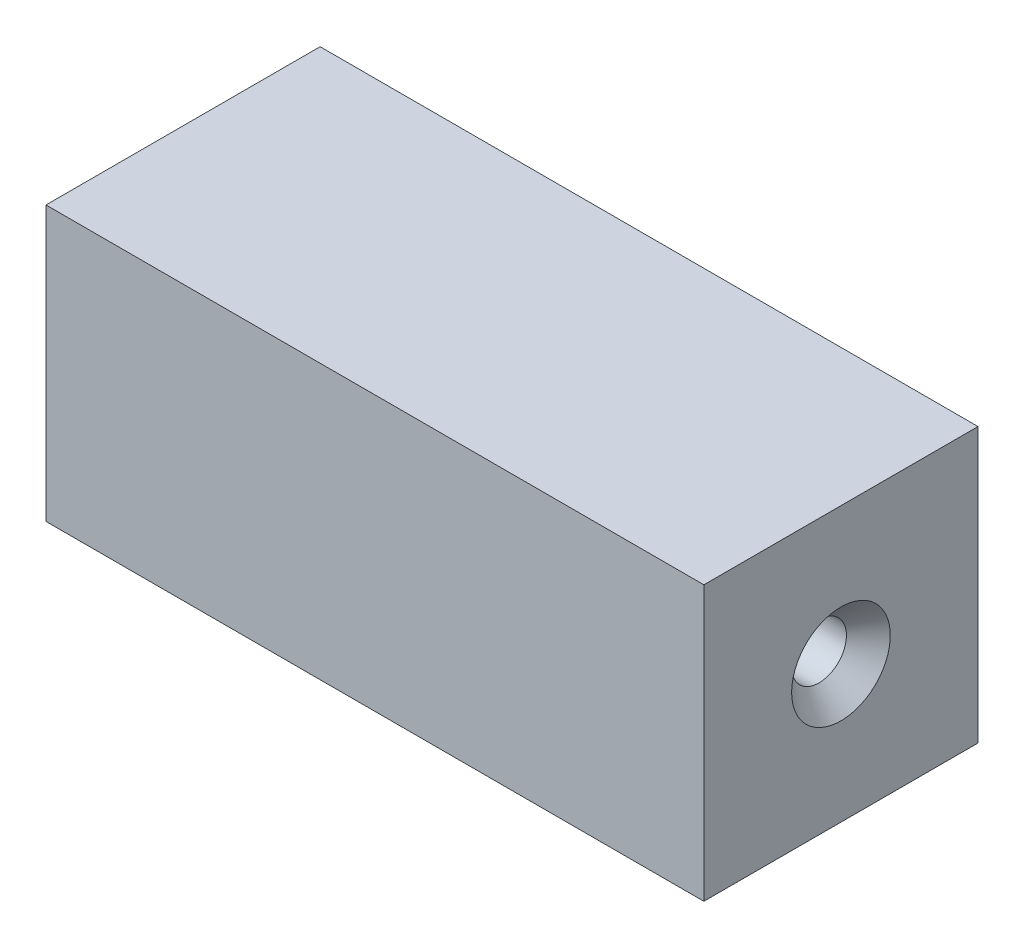
ISO-10303-21;
HEADER;
FILE_DESCRIPTION(('STEP AP214'),'2;1');
FILE_NAME('part.step','',(''),(''),'','','');
FILE_SCHEMA(('AUTOMOTIVE_DESIGN { 1 0 10303 214 1 1 1 1 }'));
ENDSEC;
DATA;
#1=APPLICATION_CONTEXT('core data for automotive mechanical design processes');
#2=APPLICATION_PROTOCOL_DEFINITION('international standard','automotive_design',2000,#1);
#3=PRODUCT_CONTEXT('',#1,'mechanical');
#4=PRODUCT('Part','Part','',(#3));
#5=PRODUCT_RELATED_PRODUCT_CATEGORY('part','',(#4));
#6=PRODUCT_DEFINITION_FORMATION('','',#4);
#7=PRODUCT_DEFINITION_CONTEXT('part definition',#1,'design');
#8=PRODUCT_DEFINITION('design','',#6,#7);
#9=PRODUCT_DEFINITION_SHAPE('','',#8);
#10=(LENGTH_UNIT() NAMED_UNIT(*) SI_UNIT(.MILLI.,.METRE.));
#11=(NAMED_UNIT(*) PLANE_ANGLE_UNIT() SI_UNIT($,.RADIAN.));
#12=(NAMED_UNIT(*) SI_UNIT($,.STERADIAN.) SOLID_ANGLE_UNIT());
#13=UNCERTAINTY_MEASURE_WITH_UNIT(LENGTH_MEASURE(1.E-05),#10,'distance_accuracy_value','');
#14=(GEOMETRIC_REPRESENTATION_CONTEXT(3) GLOBAL_UNCERTAINTY_ASSIGNED_CONTEXT((#13)) GLOBAL_UNIT_ASSIGNED_CONTEXT((#10,
#11,#12)) REPRESENTATION_CONTEXT('',''));
#15=CARTESIAN_POINT('',(0.,0.,0.));
#16=DIRECTION('',(0.,0.,1.));
#17=DIRECTION('',(1.,0.,0.));
#18=AXIS2_PLACEMENT_3D('',#15,#16,#17);
#19=CARTESIAN_POINT('',(76.2,-15.875,15.875));
#20=DIRECTION('',(0.,0.,1.));
#21=DIRECTION('',(1.,0.,0.));
#22=AXIS2_PLACEMENT_3D('',#19,#20,#21);
#23=PLANE('',#22);
#24=DIRECTION('',(0.,1.,0.));
#25=VECTOR('',#24,1.);
#26=CARTESIAN_POINT('',(0.,-15.875,15.875));
#27=LINE('',#26,#25);
#28=CARTESIAN_POINT('',(0.,-15.875,15.875));
#29=VERTEX_POINT('',#28);
#30=CARTESIAN_POINT('',(0.,15.875,15.875));
#31=VERTEX_POINT('',#30);
#32=EDGE_CURVE('E106',#29,#31,#27,.T.);
#33=ORIENTED_EDGE('',*,*,#32,.F.);
#34=DIRECTION('',(-1.,0.,0.));
#35=VECTOR('',#34,1.);
#36=CARTESIAN_POINT('',(76.2,-15.875,15.875));
#37=LINE('',#36,#35);
#38=CARTESIAN_POINT('',(76.2,-15.875,15.875));
#39=VERTEX_POINT('',#38);
#40=EDGE_CURVE('E53',#39,#29,#37,.T.);
#41=ORIENTED_EDGE('',*,*,#40,.F.);
#42=DIRECTION('',(0.,1.,0.));
#43=VECTOR('',#42,1.);
#44=CARTESIAN_POINT('',(76.2,-15.875,15.875));
#45=LINE('',#44,#43);
#46=CARTESIAN_POINT('',(76.2,15.875,15.875));
#47=VERTEX_POINT('',#46);
#48=EDGE_CURVE('E100',#39,#47,#45,.T.);
#49=ORIENTED_EDGE('',*,*,#48,.T.);
#50=DIRECTION('',(-1.,0.,0.));
#51=VECTOR('',#50,1.);
#52=CARTESIAN_POINT('',(76.2,15.875,15.875));
#53=LINE('',#52,#51);
#54=EDGE_CURVE('E78',#47,#31,#53,.T.);
#55=ORIENTED_EDGE('',*,*,#54,.T.);
#56=EDGE_LOOP('',(#33,#41,#49,#55));
#57=FACE_BOUND('',#56,.T.);
#58=ADVANCED_FACE('F35',(#57),#23,.T.);
#59=CARTESIAN_POINT('',(76.2,-15.875,15.875));
#60=DIRECTION('',(0.,1.,0.));
#61=DIRECTION('',(0.,0.,1.));
#62=AXIS2_PLACEMENT_3D('',#59,#60,#61);
#63=PLANE('',#62);
#64=DIRECTION('',(0.,0.,-1.));
#65=VECTOR('',#64,1.);
#66=CARTESIAN_POINT('',(0.,-15.875,15.875));
#67=LINE('',#66,#65);
#68=CARTESIAN_POINT('',(0.,-15.875,-15.875));
#69=VERTEX_POINT('',#68);
#70=EDGE_CURVE('E70',#29,#69,#67,.T.);
#71=ORIENTED_EDGE('',*,*,#70,.T.);
#72=DIRECTION('',(-1.,0.,0.));
#73=VECTOR('',#72,1.);
#74=CARTESIAN_POINT('',(76.2,-15.875,-15.875));
#75=LINE('',#74,#73);
#76=CARTESIAN_POINT('',(76.2,-15.875,-15.875));
#77=VERTEX_POINT('',#76);
#78=EDGE_CURVE('E97',#77,#69,#75,.T.);
#79=ORIENTED_EDGE('',*,*,#78,.F.);
#80=DIRECTION('',(0.,0.,-1.));
#81=VECTOR('',#80,1.);
#82=CARTESIAN_POINT('',(76.2,-15.875,15.875));
#83=LINE('',#82,#81);
#84=EDGE_CURVE('E88',#39,#77,#83,.T.);
#85=ORIENTED_EDGE('',*,*,#84,.F.);
#86=ORIENTED_EDGE('',*,*,#40,.T.);
#87=EDGE_LOOP('',(#71,#79,#85,#86));
#88=FACE_BOUND('',#87,.T.);
#89=ADVANCED_FACE('F132',(#88),#63,.F.);
#90=CARTESIAN_POINT('',(76.2,-15.875,-15.875));
#91=DIRECTION('',(0.,0.,1.));
#92=DIRECTION('',(1.,0.,0.));
#93=AXIS2_PLACEMENT_3D('',#90,#91,#92);
#94=PLANE('',#93);
#95=DIRECTION('',(0.,1.,0.));
#96=VECTOR('',#95,1.);
#97=CARTESIAN_POINT('',(0.,-15.875,-15.875));
#98=LINE('',#97,#96);
#99=CARTESIAN_POINT('',(0.,15.875,-15.875));
#100=VERTEX_POINT('',#99);
#101=EDGE_CURVE('E95',#69,#100,#98,.T.);
#102=ORIENTED_EDGE('',*,*,#101,.T.);
#103=DIRECTION('',(-1.,0.,0.));
#104=VECTOR('',#103,1.);
#105=CARTESIAN_POINT('',(76.2,15.875,-15.875));
#106=LINE('',#105,#104);
#107=CARTESIAN_POINT('',(76.2,15.875,-15.875));
#108=VERTEX_POINT('',#107);
#109=EDGE_CURVE('E92',#108,#100,#106,.T.);
#110=ORIENTED_EDGE('',*,*,#109,.F.);
#111=DIRECTION('',(0.,1.,0.));
#112=VECTOR('',#111,1.);
#113=CARTESIAN_POINT('',(76.2,-15.875,-15.875));
#114=LINE('',#113,#112);
#115=EDGE_CURVE('E83',#77,#108,#114,.T.);
#116=ORIENTED_EDGE('',*,*,#115,.F.);
#117=ORIENTED_EDGE('',*,*,#78,.T.);
#118=EDGE_LOOP('',(#102,#110,#116,#117));
#119=FACE_BOUND('',#118,.T.);
#120=ADVANCED_FACE('F93',(#119),#94,.F.);
#121=CARTESIAN_POINT('',(76.2,15.875,15.875));
#122=DIRECTION('',(0.,1.,0.));
#123=DIRECTION('',(0.,0.,1.));
#124=AXIS2_PLACEMENT_3D('',#121,#122,#123);
#125=PLANE('',#124);
#126=DIRECTION('',(0.,0.,-1.));
#127=VECTOR('',#126,1.);
#128=CARTESIAN_POINT('',(0.,15.875,15.875));
#129=LINE('',#128,#127);
#130=EDGE_CURVE('E109',#31,#100,#129,.T.);
#131=ORIENTED_EDGE('',*,*,#130,.F.);
#132=ORIENTED_EDGE('',*,*,#54,.F.);
#133=DIRECTION('',(0.,0.,-1.));
#134=VECTOR('',#133,1.);
#135=CARTESIAN_POINT('',(76.2,15.875,15.875));
#136=LINE('',#135,#134);
#137=EDGE_CURVE('E87',#47,#108,#136,.T.);
#138=ORIENTED_EDGE('',*,*,#137,.T.);
#139=ORIENTED_EDGE('',*,*,#109,.T.);
#140=EDGE_LOOP('',(#131,#132,#138,#139));
#141=FACE_BOUND('',#140,.T.);
#142=ADVANCED_FACE('F99',(#141),#125,.T.);
#143=CARTESIAN_POINT('',(76.2,0.,0.));
#144=DIRECTION('',(-1.,0.,0.));
#145=DIRECTION('',(0.,0.,1.));
#146=AXIS2_PLACEMENT_3D('',#143,#144,#145);
#147=PLANE('',#146);
#148=CARTESIAN_POINT('',(76.2,0.,0.));
#149=DIRECTION('',(-1.,0.,0.));
#150=DIRECTION('',(0.,0.,1.));
#151=AXIS2_PLACEMENT_3D('',#148,#149,#150);
#152=CIRCLE('',#151,5.71499999999998);
#153=CARTESIAN_POINT('',(76.2,0.,5.71499999999998));
#154=VERTEX_POINT('',#153);
#155=EDGE_CURVE('E11',#154,#154,#152,.T.);
#156=ORIENTED_EDGE('',*,*,#155,.T.);
#157=EDGE_LOOP('',(#156));
#158=FACE_BOUND('',#157,.T.);
#159=ORIENTED_EDGE('',*,*,#48,.F.);
#160=ORIENTED_EDGE('',*,*,#84,.T.);
#161=ORIENTED_EDGE('',*,*,#115,.T.);
#162=ORIENTED_EDGE('',*,*,#137,.F.);
#163=EDGE_LOOP('',(#159,#160,#161,#162));
#164=FACE_BOUND('',#163,.T.);
#165=ADVANCED_FACE('F86',(#158,#164),#147,.F.);
#166=CARTESIAN_POINT('',(0.,0.,0.));
#167=DIRECTION('',(-1.,0.,0.));
#168=DIRECTION('',(0.,0.,1.));
#169=AXIS2_PLACEMENT_3D('',#166,#167,#168);
#170=PLANE('',#169);
#171=ORIENTED_EDGE('',*,*,#32,.T.);
#172=ORIENTED_EDGE('',*,*,#130,.T.);
#173=ORIENTED_EDGE('',*,*,#101,.F.);
#174=ORIENTED_EDGE('',*,*,#70,.F.);
#175=EDGE_LOOP('',(#171,#172,#173,#174));
#176=FACE_BOUND('',#175,.T.);
#177=ADVANCED_FACE('F142',(#176),#170,.T.);
#178=CARTESIAN_POINT('',(50.8,0.,0.));
#179=DIRECTION('',(1.,0.,0.));
#180=DIRECTION('',(0.,0.,-1.));
#181=AXIS2_PLACEMENT_3D('',#178,#179,#180);
#182=CYLINDRICAL_SURFACE('',#181,3.175);
#183=CARTESIAN_POINT('',(73.66,0.,0.));
#184=DIRECTION('',(-1.,0.,0.));
#185=DIRECTION('',(0.,0.,1.));
#186=AXIS2_PLACEMENT_3D('',#183,#184,#185);
#187=CIRCLE('',#186,3.175);
#188=CARTESIAN_POINT('',(73.66,0.,3.175));
#189=VERTEX_POINT('',#188);
#190=EDGE_CURVE('E45',#189,#189,#187,.F.);
#191=ORIENTED_EDGE('',*,*,#190,.T.);
#192=EDGE_LOOP('',(#191));
#193=FACE_BOUND('',#192,.T.);
#194=CARTESIAN_POINT('',(50.8,0.,0.));
#195=DIRECTION('',(1.,0.,0.));
#196=DIRECTION('',(0.,0.,-1.));
#197=AXIS2_PLACEMENT_3D('',#194,#195,#196);
#198=CIRCLE('',#197,3.175);
#199=CARTESIAN_POINT('',(50.8,0.,-3.175));
#200=VERTEX_POINT('',#199);
#201=EDGE_CURVE('E110',#200,#200,#198,.T.);
#202=ORIENTED_EDGE('',*,*,#201,.F.);
#203=EDGE_LOOP('',(#202));
#204=FACE_BOUND('',#203,.T.);
#205=ADVANCED_FACE('F119',(#193,#204),#182,.F.);
#206=CARTESIAN_POINT('',(50.8,0.,0.));
#207=DIRECTION('',(1.,0.,0.));
#208=DIRECTION('',(0.,0.,-1.));
#209=AXIS2_PLACEMENT_3D('',#206,#207,#208);
#210=PLANE('',#209);
#211=ORIENTED_EDGE('',*,*,#201,.T.);
#212=EDGE_LOOP('',(#211));
#213=FACE_BOUND('',#212,.T.);
#214=ADVANCED_FACE('F123',(#213),#210,.T.);
#215=CARTESIAN_POINT('',(73.66,0.,0.));
#216=DIRECTION('',(1.,0.,0.));
#217=DIRECTION('',(0.,0.,-1.));
#218=AXIS2_PLACEMENT_3D('',#215,#216,#217);
#219=CONICAL_SURFACE('',#218,3.175,0.78539816339745);
#220=ORIENTED_EDGE('',*,*,#155,.F.);
#221=EDGE_LOOP('',(#220));
#222=FACE_BOUND('',#221,.T.);
#223=ORIENTED_EDGE('',*,*,#190,.F.);
#224=EDGE_LOOP('',(#223));
#225=FACE_BOUND('',#224,.T.);
#226=ADVANCED_FACE('F38',(#222,#225),#219,.F.);
#227=CLOSED_SHELL('',(#58,#89,#120,#142,#165,#177,#205,#214,#226));
#228=MANIFOLD_SOLID_BREP('B2',#227);
#229=ADVANCED_BREP_SHAPE_REPRESENTATION('',(#18,#228),#14);
#230=SHAPE_DEFINITION_REPRESENTATION(#9,#229);
ENDSEC;
END-ISO-10303-21;
